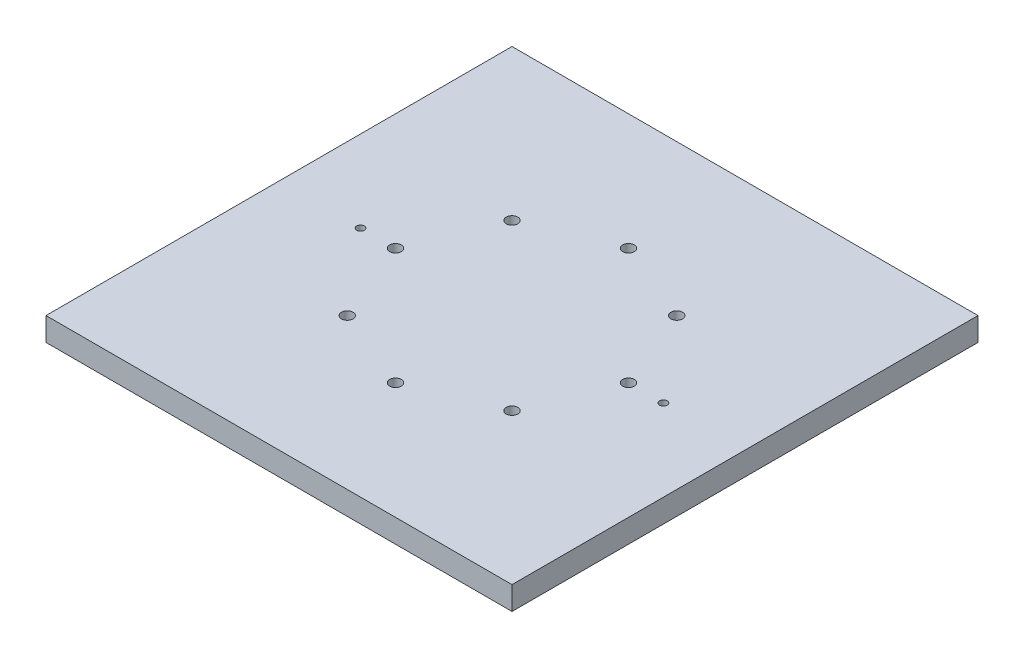
ISO-10303-21;
HEADER;
FILE_DESCRIPTION(('STEP AP214'),'2;1');
FILE_NAME('part.step','',(''),(''),'','','');
FILE_SCHEMA(('AUTOMOTIVE_DESIGN { 1 0 10303 214 1 1 1 1 }'));
ENDSEC;
DATA;
#1=APPLICATION_CONTEXT('core data for automotive mechanical design processes');
#2=APPLICATION_PROTOCOL_DEFINITION('international standard','automotive_design',2000,#1);
#3=PRODUCT_CONTEXT('',#1,'mechanical');
#4=PRODUCT('Part','Part','',(#3));
#5=PRODUCT_RELATED_PRODUCT_CATEGORY('part','',(#4));
#6=PRODUCT_DEFINITION_FORMATION('','',#4);
#7=PRODUCT_DEFINITION_CONTEXT('part definition',#1,'design');
#8=PRODUCT_DEFINITION('design','',#6,#7);
#9=PRODUCT_DEFINITION_SHAPE('','',#8);
#10=(LENGTH_UNIT() NAMED_UNIT(*) SI_UNIT(.MILLI.,.METRE.));
#11=(NAMED_UNIT(*) PLANE_ANGLE_UNIT() SI_UNIT($,.RADIAN.));
#12=(NAMED_UNIT(*) SI_UNIT($,.STERADIAN.) SOLID_ANGLE_UNIT());
#13=UNCERTAINTY_MEASURE_WITH_UNIT(LENGTH_MEASURE(1.E-05),#10,'distance_accuracy_value','');
#14=(GEOMETRIC_REPRESENTATION_CONTEXT(3) GLOBAL_UNCERTAINTY_ASSIGNED_CONTEXT((#13)) GLOBAL_UNIT_ASSIGNED_CONTEXT((#10,
#11,#12)) REPRESENTATION_CONTEXT('',''));
#15=CARTESIAN_POINT('',(0.,0.,0.));
#16=DIRECTION('',(0.,0.,1.));
#17=DIRECTION('',(1.,0.,0.));
#18=AXIS2_PLACEMENT_3D('',#15,#16,#17);
#19=CARTESIAN_POINT('',(127.,12.7,127.));
#20=DIRECTION('',(-1.,0.,0.));
#21=DIRECTION('',(0.,0.,1.));
#22=AXIS2_PLACEMENT_3D('',#19,#20,#21);
#23=PLANE('',#22);
#24=DIRECTION('',(0.,0.,-1.));
#25=VECTOR('',#24,1.);
#26=CARTESIAN_POINT('',(127.,0.,127.));
#27=LINE('',#26,#25);
#28=CARTESIAN_POINT('',(127.,0.,127.));
#29=VERTEX_POINT('',#28);
#30=CARTESIAN_POINT('',(127.,0.,-127.));
#31=VERTEX_POINT('',#30);
#32=EDGE_CURVE('E109',#29,#31,#27,.T.);
#33=ORIENTED_EDGE('',*,*,#32,.T.);
#34=DIRECTION('',(0.,-1.,0.));
#35=VECTOR('',#34,1.);
#36=CARTESIAN_POINT('',(127.,12.7,-127.));
#37=LINE('',#36,#35);
#38=CARTESIAN_POINT('',(127.,12.7,-127.));
#39=VERTEX_POINT('',#38);
#40=EDGE_CURVE('E13',#39,#31,#37,.T.);
#41=ORIENTED_EDGE('',*,*,#40,.F.);
#42=DIRECTION('',(0.,0.,-1.));
#43=VECTOR('',#42,1.);
#44=CARTESIAN_POINT('',(127.,12.7,127.));
#45=LINE('',#44,#43);
#46=CARTESIAN_POINT('',(127.,12.7,127.));
#47=VERTEX_POINT('',#46);
#48=EDGE_CURVE('E97',#47,#39,#45,.T.);
#49=ORIENTED_EDGE('',*,*,#48,.F.);
#50=DIRECTION('',(0.,-1.,0.));
#51=VECTOR('',#50,1.);
#52=CARTESIAN_POINT('',(127.,12.7,127.));
#53=LINE('',#52,#51);
#54=EDGE_CURVE('E105',#47,#29,#53,.T.);
#55=ORIENTED_EDGE('',*,*,#54,.T.);
#56=EDGE_LOOP('',(#33,#41,#49,#55));
#57=FACE_BOUND('',#56,.T.);
#58=ADVANCED_FACE('F46',(#57),#23,.F.);
#59=CARTESIAN_POINT('',(-127.,12.7,-127.));
#60=DIRECTION('',(0.,0.,1.));
#61=DIRECTION('',(1.,0.,0.));
#62=AXIS2_PLACEMENT_3D('',#59,#60,#61);
#63=PLANE('',#62);
#64=DIRECTION('',(-1.,0.,0.));
#65=VECTOR('',#64,1.);
#66=CARTESIAN_POINT('',(-127.,0.,-127.));
#67=LINE('',#66,#65);
#68=CARTESIAN_POINT('',(-127.,0.,-127.));
#69=VERTEX_POINT('',#68);
#70=EDGE_CURVE('E101',#31,#69,#67,.T.);
#71=ORIENTED_EDGE('',*,*,#70,.T.);
#72=DIRECTION('',(0.,-1.,0.));
#73=VECTOR('',#72,1.);
#74=CARTESIAN_POINT('',(-127.,12.7,-127.));
#75=LINE('',#74,#73);
#76=CARTESIAN_POINT('',(-127.,12.7,-127.));
#77=VERTEX_POINT('',#76);
#78=EDGE_CURVE('E54',#77,#69,#75,.T.);
#79=ORIENTED_EDGE('',*,*,#78,.F.);
#80=DIRECTION('',(-1.,0.,0.));
#81=VECTOR('',#80,1.);
#82=CARTESIAN_POINT('',(-127.,12.7,-127.));
#83=LINE('',#82,#81);
#84=EDGE_CURVE('E92',#39,#77,#83,.T.);
#85=ORIENTED_EDGE('',*,*,#84,.F.);
#86=ORIENTED_EDGE('',*,*,#40,.T.);
#87=EDGE_LOOP('',(#71,#79,#85,#86));
#88=FACE_BOUND('',#87,.T.);
#89=ADVANCED_FACE('F100',(#88),#63,.F.);
#90=CARTESIAN_POINT('',(-127.,12.7,127.));
#91=DIRECTION('',(1.,0.,0.));
#92=DIRECTION('',(0.,0.,-1.));
#93=AXIS2_PLACEMENT_3D('',#90,#91,#92);
#94=PLANE('',#93);
#95=DIRECTION('',(0.,0.,1.));
#96=VECTOR('',#95,1.);
#97=CARTESIAN_POINT('',(-127.,0.,127.));
#98=LINE('',#97,#96);
#99=CARTESIAN_POINT('',(-127.,0.,127.));
#100=VERTEX_POINT('',#99);
#101=EDGE_CURVE('E79',#69,#100,#98,.T.);
#102=ORIENTED_EDGE('',*,*,#101,.T.);
#103=DIRECTION('',(0.,-1.,0.));
#104=VECTOR('',#103,1.);
#105=CARTESIAN_POINT('',(-127.,12.7,127.));
#106=LINE('',#105,#104);
#107=CARTESIAN_POINT('',(-127.,12.7,127.));
#108=VERTEX_POINT('',#107);
#109=EDGE_CURVE('E102',#108,#100,#106,.T.);
#110=ORIENTED_EDGE('',*,*,#109,.F.);
#111=DIRECTION('',(0.,0.,1.));
#112=VECTOR('',#111,1.);
#113=CARTESIAN_POINT('',(-127.,12.7,127.));
#114=LINE('',#113,#112);
#115=EDGE_CURVE('E95',#77,#108,#114,.T.);
#116=ORIENTED_EDGE('',*,*,#115,.F.);
#117=ORIENTED_EDGE('',*,*,#78,.T.);
#118=EDGE_LOOP('',(#102,#110,#116,#117));
#119=FACE_BOUND('',#118,.T.);
#120=ADVANCED_FACE('F103',(#119),#94,.F.);
#121=CARTESIAN_POINT('',(-127.,12.7,127.));
#122=DIRECTION('',(0.,0.,-1.));
#123=DIRECTION('',(-1.,0.,0.));
#124=AXIS2_PLACEMENT_3D('',#121,#122,#123);
#125=PLANE('',#124);
#126=DIRECTION('',(1.,0.,0.));
#127=VECTOR('',#126,1.);
#128=CARTESIAN_POINT('',(-127.,0.,127.));
#129=LINE('',#128,#127);
#130=EDGE_CURVE('E85',#100,#29,#129,.T.);
#131=ORIENTED_EDGE('',*,*,#130,.T.);
#132=ORIENTED_EDGE('',*,*,#54,.F.);
#133=DIRECTION('',(1.,0.,0.));
#134=VECTOR('',#133,1.);
#135=CARTESIAN_POINT('',(-127.,12.7,127.));
#136=LINE('',#135,#134);
#137=EDGE_CURVE('E62',#108,#47,#136,.T.);
#138=ORIENTED_EDGE('',*,*,#137,.F.);
#139=ORIENTED_EDGE('',*,*,#109,.T.);
#140=EDGE_LOOP('',(#131,#132,#138,#139));
#141=FACE_BOUND('',#140,.T.);
#142=ADVANCED_FACE('F117',(#141),#125,.F.);
#143=CARTESIAN_POINT('',(0.,12.7,0.));
#144=DIRECTION('',(0.,-1.,0.));
#145=DIRECTION('',(0.,0.,-1.));
#146=AXIS2_PLACEMENT_3D('',#143,#144,#145);
#147=PLANE('',#146);
#148=CARTESIAN_POINT('',(-82.55,12.7,0.));
#149=DIRECTION('',(0.,-1.,0.));
#150=DIRECTION('',(0.,0.,-1.));
#151=AXIS2_PLACEMENT_3D('',#148,#149,#150);
#152=CIRCLE('',#151,2.0828);
#153=CARTESIAN_POINT('',(-82.55,12.7,-2.08279999999997));
#154=VERTEX_POINT('',#153);
#155=EDGE_CURVE('E151',#154,#154,#152,.T.);
#156=ORIENTED_EDGE('',*,*,#155,.T.);
#157=EDGE_LOOP('',(#156));
#158=FACE_BOUND('',#157,.T.);
#159=CARTESIAN_POINT('',(82.55,12.7,0.));
#160=DIRECTION('',(0.,-1.,0.));
#161=DIRECTION('',(0.,0.,-1.));
#162=AXIS2_PLACEMENT_3D('',#159,#160,#161);
#163=CIRCLE('',#162,2.0828);
#164=CARTESIAN_POINT('',(82.55,12.7,-2.08279999999999));
#165=VERTEX_POINT('',#164);
#166=EDGE_CURVE('E173',#165,#165,#163,.T.);
#167=ORIENTED_EDGE('',*,*,#166,.T.);
#168=EDGE_LOOP('',(#167));
#169=FACE_BOUND('',#168,.T.);
#170=CARTESIAN_POINT('',(0.,12.7,-63.5));
#171=DIRECTION('',(0.,-1.,0.));
#172=DIRECTION('',(0.,0.,-1.));
#173=AXIS2_PLACEMENT_3D('',#170,#171,#172);
#174=CIRCLE('',#173,3.175);
#175=CARTESIAN_POINT('',(0.,12.7,-66.675));
#176=VERTEX_POINT('',#175);
#177=EDGE_CURVE('E112',#176,#176,#174,.T.);
#178=ORIENTED_EDGE('',*,*,#177,.T.);
#179=EDGE_LOOP('',(#178));
#180=FACE_BOUND('',#179,.T.);
#181=CARTESIAN_POINT('',(44.9012806053459,12.7,-44.9012806053457));
#182=DIRECTION('',(0.,-1.,0.));
#183=DIRECTION('',(0.,0.,-1.));
#184=AXIS2_PLACEMENT_3D('',#181,#182,#183);
#185=CIRCLE('',#184,3.17499999999998);
#186=CARTESIAN_POINT('',(44.9012806053459,12.7,-48.0762806053456));
#187=VERTEX_POINT('',#186);
#188=EDGE_CURVE('E125',#187,#187,#185,.T.);
#189=ORIENTED_EDGE('',*,*,#188,.T.);
#190=EDGE_LOOP('',(#189));
#191=FACE_BOUND('',#190,.T.);
#192=CARTESIAN_POINT('',(63.5,12.7,2.38641928986795E-13));
#193=DIRECTION('',(0.,-1.,0.));
#194=DIRECTION('',(0.,0.,-1.));
#195=AXIS2_PLACEMENT_3D('',#192,#193,#194);
#196=CIRCLE('',#195,3.175);
#197=CARTESIAN_POINT('',(63.5,12.7,-3.17499999999976));
#198=VERTEX_POINT('',#197);
#199=EDGE_CURVE('E128',#198,#198,#196,.T.);
#200=ORIENTED_EDGE('',*,*,#199,.T.);
#201=EDGE_LOOP('',(#200));
#202=FACE_BOUND('',#201,.T.);
#203=CARTESIAN_POINT('',(44.9012806053455,12.7,44.901280605346));
#204=DIRECTION('',(0.,-1.,0.));
#205=DIRECTION('',(0.,0.,-1.));
#206=AXIS2_PLACEMENT_3D('',#203,#204,#205);
#207=CIRCLE('',#206,3.17499999999999);
#208=CARTESIAN_POINT('',(44.9012806053455,12.7,41.726280605346));
#209=VERTEX_POINT('',#208);
#210=EDGE_CURVE('E131',#209,#209,#207,.T.);
#211=ORIENTED_EDGE('',*,*,#210,.T.);
#212=EDGE_LOOP('',(#211));
#213=FACE_BOUND('',#212,.T.);
#214=CARTESIAN_POINT('',(-4.60350994003334E-13,12.7,63.5));
#215=DIRECTION('',(0.,-1.,0.));
#216=DIRECTION('',(0.,0.,-1.));
#217=AXIS2_PLACEMENT_3D('',#214,#215,#216);
#218=CIRCLE('',#217,3.17499999999999);
#219=CARTESIAN_POINT('',(-4.60350994003334E-13,12.7,60.325));
#220=VERTEX_POINT('',#219);
#221=EDGE_CURVE('E134',#220,#220,#218,.T.);
#222=ORIENTED_EDGE('',*,*,#221,.T.);
#223=EDGE_LOOP('',(#222));
#224=FACE_BOUND('',#223,.T.);
#225=CARTESIAN_POINT('',(-44.9012806053462,12.7,44.9012806053454));
#226=DIRECTION('',(0.,-1.,0.));
#227=DIRECTION('',(0.,0.,-1.));
#228=AXIS2_PLACEMENT_3D('',#225,#226,#227);
#229=CIRCLE('',#228,3.175);
#230=CARTESIAN_POINT('',(-44.9012806053462,12.7,41.7262806053454));
#231=VERTEX_POINT('',#230);
#232=EDGE_CURVE('E137',#231,#231,#229,.T.);
#233=ORIENTED_EDGE('',*,*,#232,.T.);
#234=EDGE_LOOP('',(#233));
#235=FACE_BOUND('',#234,.T.);
#236=CARTESIAN_POINT('',(-63.5,12.7,-6.82060059019873E-13));
#237=DIRECTION('',(0.,-1.,0.));
#238=DIRECTION('',(0.,0.,-1.));
#239=AXIS2_PLACEMENT_3D('',#236,#237,#238);
#240=CIRCLE('',#239,3.175);
#241=CARTESIAN_POINT('',(-63.5,12.7,-3.17500000000068));
#242=VERTEX_POINT('',#241);
#243=EDGE_CURVE('E140',#242,#242,#240,.T.);
#244=ORIENTED_EDGE('',*,*,#243,.T.);
#245=EDGE_LOOP('',(#244));
#246=FACE_BOUND('',#245,.T.);
#247=CARTESIAN_POINT('',(-44.9012806053452,12.7,-44.9012806053463));
#248=DIRECTION('',(0.,-1.,0.));
#249=DIRECTION('',(0.,0.,-1.));
#250=AXIS2_PLACEMENT_3D('',#247,#248,#249);
#251=CIRCLE('',#250,3.17499999999999);
#252=CARTESIAN_POINT('',(-44.9012806053452,12.7,-48.0762806053463));
#253=VERTEX_POINT('',#252);
#254=EDGE_CURVE('E143',#253,#253,#251,.T.);
#255=ORIENTED_EDGE('',*,*,#254,.T.);
#256=EDGE_LOOP('',(#255));
#257=FACE_BOUND('',#256,.T.);
#258=ORIENTED_EDGE('',*,*,#48,.T.);
#259=ORIENTED_EDGE('',*,*,#84,.T.);
#260=ORIENTED_EDGE('',*,*,#115,.T.);
#261=ORIENTED_EDGE('',*,*,#137,.T.);
#262=EDGE_LOOP('',(#258,#259,#260,#261));
#263=FACE_BOUND('',#262,.T.);
#264=ADVANCED_FACE('F93',(#158,#169,#180,#191,#202,#213,#224,#235,#246,#257,#263),#147,.F.);
#265=CARTESIAN_POINT('',(0.,0.,0.));
#266=DIRECTION('',(0.,-1.,0.));
#267=DIRECTION('',(0.,0.,-1.));
#268=AXIS2_PLACEMENT_3D('',#265,#266,#267);
#269=PLANE('',#268);
#270=CARTESIAN_POINT('',(-82.55,0.,0.));
#271=DIRECTION('',(0.,1.,0.));
#272=DIRECTION('',(0.,0.,1.));
#273=AXIS2_PLACEMENT_3D('',#270,#271,#272);
#274=CIRCLE('',#273,2.0828);
#275=CARTESIAN_POINT('',(-82.55,0.,2.08280000000003));
#276=VERTEX_POINT('',#275);
#277=EDGE_CURVE('E176',#276,#276,#274,.T.);
#278=ORIENTED_EDGE('',*,*,#277,.T.);
#279=EDGE_LOOP('',(#278));
#280=FACE_BOUND('',#279,.T.);
#281=CARTESIAN_POINT('',(82.55,0.,0.));
#282=DIRECTION('',(0.,1.,0.));
#283=DIRECTION('',(0.,0.,1.));
#284=AXIS2_PLACEMENT_3D('',#281,#282,#283);
#285=CIRCLE('',#284,2.0828);
#286=CARTESIAN_POINT('',(82.55,0.,2.08280000000001));
#287=VERTEX_POINT('',#286);
#288=EDGE_CURVE('E177',#287,#287,#285,.T.);
#289=ORIENTED_EDGE('',*,*,#288,.T.);
#290=EDGE_LOOP('',(#289));
#291=FACE_BOUND('',#290,.T.);
#292=CARTESIAN_POINT('',(0.,0.,-63.5));
#293=DIRECTION('',(0.,1.,0.));
#294=DIRECTION('',(0.,0.,1.));
#295=AXIS2_PLACEMENT_3D('',#292,#293,#294);
#296=CIRCLE('',#295,3.175);
#297=CARTESIAN_POINT('',(0.,0.,-60.325));
#298=VERTEX_POINT('',#297);
#299=EDGE_CURVE('E146',#298,#298,#296,.T.);
#300=ORIENTED_EDGE('',*,*,#299,.T.);
#301=EDGE_LOOP('',(#300));
#302=FACE_BOUND('',#301,.T.);
#303=CARTESIAN_POINT('',(44.9012806053459,0.,-44.9012806053457));
#304=DIRECTION('',(0.,1.,0.));
#305=DIRECTION('',(0.,0.,1.));
#306=AXIS2_PLACEMENT_3D('',#303,#304,#305);
#307=CIRCLE('',#306,3.17499999999998);
#308=CARTESIAN_POINT('',(44.9012806053459,0.,-41.7262806053457));
#309=VERTEX_POINT('',#308);
#310=EDGE_CURVE('E166',#309,#309,#307,.T.);
#311=ORIENTED_EDGE('',*,*,#310,.T.);
#312=EDGE_LOOP('',(#311));
#313=FACE_BOUND('',#312,.T.);
#314=CARTESIAN_POINT('',(63.5,0.,2.38641928986795E-13));
#315=DIRECTION('',(0.,1.,0.));
#316=DIRECTION('',(0.,0.,1.));
#317=AXIS2_PLACEMENT_3D('',#314,#315,#316);
#318=CIRCLE('',#317,3.175);
#319=CARTESIAN_POINT('',(63.5,0.,3.17500000000023));
#320=VERTEX_POINT('',#319);
#321=EDGE_CURVE('E163',#320,#320,#318,.T.);
#322=ORIENTED_EDGE('',*,*,#321,.T.);
#323=EDGE_LOOP('',(#322));
#324=FACE_BOUND('',#323,.T.);
#325=CARTESIAN_POINT('',(44.9012806053455,0.,44.901280605346));
#326=DIRECTION('',(0.,1.,0.));
#327=DIRECTION('',(0.,0.,1.));
#328=AXIS2_PLACEMENT_3D('',#325,#326,#327);
#329=CIRCLE('',#328,3.17499999999999);
#330=CARTESIAN_POINT('',(44.9012806053455,0.,48.076280605346));
#331=VERTEX_POINT('',#330);
#332=EDGE_CURVE('E160',#331,#331,#329,.T.);
#333=ORIENTED_EDGE('',*,*,#332,.T.);
#334=EDGE_LOOP('',(#333));
#335=FACE_BOUND('',#334,.T.);
#336=CARTESIAN_POINT('',(-4.60350994003334E-13,0.,63.5));
#337=DIRECTION('',(0.,1.,0.));
#338=DIRECTION('',(0.,0.,1.));
#339=AXIS2_PLACEMENT_3D('',#336,#337,#338);
#340=CIRCLE('',#339,3.17499999999999);
#341=CARTESIAN_POINT('',(-4.60350994003334E-13,0.,66.675));
#342=VERTEX_POINT('',#341);
#343=EDGE_CURVE('E157',#342,#342,#340,.T.);
#344=ORIENTED_EDGE('',*,*,#343,.T.);
#345=EDGE_LOOP('',(#344));
#346=FACE_BOUND('',#345,.T.);
#347=CARTESIAN_POINT('',(-44.9012806053462,0.,44.9012806053454));
#348=DIRECTION('',(0.,1.,0.));
#349=DIRECTION('',(0.,0.,1.));
#350=AXIS2_PLACEMENT_3D('',#347,#348,#349);
#351=CIRCLE('',#350,3.175);
#352=CARTESIAN_POINT('',(-44.9012806053462,0.,48.0762806053454));
#353=VERTEX_POINT('',#352);
#354=EDGE_CURVE('E154',#353,#353,#351,.T.);
#355=ORIENTED_EDGE('',*,*,#354,.T.);
#356=EDGE_LOOP('',(#355));
#357=FACE_BOUND('',#356,.T.);
#358=CARTESIAN_POINT('',(-63.5,0.,-6.82060059019873E-13));
#359=DIRECTION('',(0.,1.,0.));
#360=DIRECTION('',(0.,0.,1.));
#361=AXIS2_PLACEMENT_3D('',#358,#359,#360);
#362=CIRCLE('',#361,3.175);
#363=CARTESIAN_POINT('',(-63.5,0.,3.17499999999932));
#364=VERTEX_POINT('',#363);
#365=EDGE_CURVE('E150',#364,#364,#362,.T.);
#366=ORIENTED_EDGE('',*,*,#365,.T.);
#367=EDGE_LOOP('',(#366));
#368=FACE_BOUND('',#367,.T.);
#369=CARTESIAN_POINT('',(-44.9012806053452,0.,-44.9012806053463));
#370=DIRECTION('',(0.,1.,0.));
#371=DIRECTION('',(0.,0.,1.));
#372=AXIS2_PLACEMENT_3D('',#369,#370,#371);
#373=CIRCLE('',#372,3.17499999999999);
#374=CARTESIAN_POINT('',(-44.9012806053452,0.,-41.7262806053464));
#375=VERTEX_POINT('',#374);
#376=EDGE_CURVE('E147',#375,#375,#373,.T.);
#377=ORIENTED_EDGE('',*,*,#376,.T.);
#378=EDGE_LOOP('',(#377));
#379=FACE_BOUND('',#378,.T.);
#380=ORIENTED_EDGE('',*,*,#32,.F.);
#381=ORIENTED_EDGE('',*,*,#130,.F.);
#382=ORIENTED_EDGE('',*,*,#101,.F.);
#383=ORIENTED_EDGE('',*,*,#70,.F.);
#384=EDGE_LOOP('',(#380,#381,#382,#383));
#385=FACE_BOUND('',#384,.T.);
#386=ADVANCED_FACE('F120',(#280,#291,#302,#313,#324,#335,#346,#357,#368,#379,#385),#269,.T.);
#387=CARTESIAN_POINT('',(-44.9012806053452,0.,-44.9012806053463));
#388=DIRECTION('',(0.,1.,0.));
#389=DIRECTION('',(0.,0.,1.));
#390=AXIS2_PLACEMENT_3D('',#387,#388,#389);
#391=CYLINDRICAL_SURFACE('',#390,3.17499999999999);
#392=ORIENTED_EDGE('',*,*,#376,.F.);
#393=EDGE_LOOP('',(#392));
#394=FACE_BOUND('',#393,.T.);
#395=ORIENTED_EDGE('',*,*,#254,.F.);
#396=EDGE_LOOP('',(#395));
#397=FACE_BOUND('',#396,.T.);
#398=ADVANCED_FACE('F213',(#394,#397),#391,.F.);
#399=CARTESIAN_POINT('',(-63.5,0.,-6.82060059019873E-13));
#400=DIRECTION('',(0.,1.,0.));
#401=DIRECTION('',(0.,0.,1.));
#402=AXIS2_PLACEMENT_3D('',#399,#400,#401);
#403=CYLINDRICAL_SURFACE('',#402,3.175);
#404=ORIENTED_EDGE('',*,*,#365,.F.);
#405=EDGE_LOOP('',(#404));
#406=FACE_BOUND('',#405,.T.);
#407=ORIENTED_EDGE('',*,*,#243,.F.);
#408=EDGE_LOOP('',(#407));
#409=FACE_BOUND('',#408,.T.);
#410=ADVANCED_FACE('F215',(#406,#409),#403,.F.);
#411=CARTESIAN_POINT('',(-44.9012806053462,0.,44.9012806053454));
#412=DIRECTION('',(0.,1.,0.));
#413=DIRECTION('',(0.,0.,1.));
#414=AXIS2_PLACEMENT_3D('',#411,#412,#413);
#415=CYLINDRICAL_SURFACE('',#414,3.175);
#416=ORIENTED_EDGE('',*,*,#354,.F.);
#417=EDGE_LOOP('',(#416));
#418=FACE_BOUND('',#417,.T.);
#419=ORIENTED_EDGE('',*,*,#232,.F.);
#420=EDGE_LOOP('',(#419));
#421=FACE_BOUND('',#420,.T.);
#422=ADVANCED_FACE('F222',(#418,#421),#415,.F.);
#423=CARTESIAN_POINT('',(-4.60350994003334E-13,0.,63.5));
#424=DIRECTION('',(0.,1.,0.));
#425=DIRECTION('',(0.,0.,1.));
#426=AXIS2_PLACEMENT_3D('',#423,#424,#425);
#427=CYLINDRICAL_SURFACE('',#426,3.17499999999999);
#428=ORIENTED_EDGE('',*,*,#343,.F.);
#429=EDGE_LOOP('',(#428));
#430=FACE_BOUND('',#429,.T.);
#431=ORIENTED_EDGE('',*,*,#221,.F.);
#432=EDGE_LOOP('',(#431));
#433=FACE_BOUND('',#432,.T.);
#434=ADVANCED_FACE('F298',(#430,#433),#427,.F.);
#435=CARTESIAN_POINT('',(44.9012806053455,0.,44.901280605346));
#436=DIRECTION('',(0.,1.,0.));
#437=DIRECTION('',(0.,0.,1.));
#438=AXIS2_PLACEMENT_3D('',#435,#436,#437);
#439=CYLINDRICAL_SURFACE('',#438,3.17499999999999);
#440=ORIENTED_EDGE('',*,*,#332,.F.);
#441=EDGE_LOOP('',(#440));
#442=FACE_BOUND('',#441,.T.);
#443=ORIENTED_EDGE('',*,*,#210,.F.);
#444=EDGE_LOOP('',(#443));
#445=FACE_BOUND('',#444,.T.);
#446=ADVANCED_FACE('F290',(#442,#445),#439,.F.);
#447=CARTESIAN_POINT('',(63.5,0.,2.38641928986795E-13));
#448=DIRECTION('',(0.,1.,0.));
#449=DIRECTION('',(0.,0.,1.));
#450=AXIS2_PLACEMENT_3D('',#447,#448,#449);
#451=CYLINDRICAL_SURFACE('',#450,3.175);
#452=ORIENTED_EDGE('',*,*,#321,.F.);
#453=EDGE_LOOP('',(#452));
#454=FACE_BOUND('',#453,.T.);
#455=ORIENTED_EDGE('',*,*,#199,.F.);
#456=EDGE_LOOP('',(#455));
#457=FACE_BOUND('',#456,.T.);
#458=ADVANCED_FACE('F282',(#454,#457),#451,.F.);
#459=CARTESIAN_POINT('',(44.9012806053459,0.,-44.9012806053457));
#460=DIRECTION('',(0.,1.,0.));
#461=DIRECTION('',(0.,0.,1.));
#462=AXIS2_PLACEMENT_3D('',#459,#460,#461);
#463=CYLINDRICAL_SURFACE('',#462,3.17499999999998);
#464=ORIENTED_EDGE('',*,*,#310,.F.);
#465=EDGE_LOOP('',(#464));
#466=FACE_BOUND('',#465,.T.);
#467=ORIENTED_EDGE('',*,*,#188,.F.);
#468=EDGE_LOOP('',(#467));
#469=FACE_BOUND('',#468,.T.);
#470=ADVANCED_FACE('F275',(#466,#469),#463,.F.);
#471=CARTESIAN_POINT('',(0.,0.,-63.5));
#472=DIRECTION('',(0.,1.,0.));
#473=DIRECTION('',(0.,0.,1.));
#474=AXIS2_PLACEMENT_3D('',#471,#472,#473);
#475=CYLINDRICAL_SURFACE('',#474,3.175);
#476=ORIENTED_EDGE('',*,*,#299,.F.);
#477=EDGE_LOOP('',(#476));
#478=FACE_BOUND('',#477,.T.);
#479=ORIENTED_EDGE('',*,*,#177,.F.);
#480=EDGE_LOOP('',(#479));
#481=FACE_BOUND('',#480,.T.);
#482=ADVANCED_FACE('F260',(#478,#481),#475,.F.);
#483=CARTESIAN_POINT('',(82.55,0.,0.));
#484=DIRECTION('',(0.,1.,0.));
#485=DIRECTION('',(0.,0.,1.));
#486=AXIS2_PLACEMENT_3D('',#483,#484,#485);
#487=CYLINDRICAL_SURFACE('',#486,2.0828);
#488=ORIENTED_EDGE('',*,*,#288,.F.);
#489=EDGE_LOOP('',(#488));
#490=FACE_BOUND('',#489,.T.);
#491=ORIENTED_EDGE('',*,*,#166,.F.);
#492=EDGE_LOOP('',(#491));
#493=FACE_BOUND('',#492,.T.);
#494=ADVANCED_FACE('F188',(#490,#493),#487,.F.);
#495=CARTESIAN_POINT('',(-82.55,0.,0.));
#496=DIRECTION('',(0.,1.,0.));
#497=DIRECTION('',(0.,0.,1.));
#498=AXIS2_PLACEMENT_3D('',#495,#496,#497);
#499=CYLINDRICAL_SURFACE('',#498,2.0828);
#500=ORIENTED_EDGE('',*,*,#277,.F.);
#501=EDGE_LOOP('',(#500));
#502=FACE_BOUND('',#501,.T.);
#503=ORIENTED_EDGE('',*,*,#155,.F.);
#504=EDGE_LOOP('',(#503));
#505=FACE_BOUND('',#504,.T.);
#506=ADVANCED_FACE('F185',(#502,#505),#499,.F.);
#507=CLOSED_SHELL('',(#58,#89,#120,#142,#264,#386,#398,#410,#422,#434,#446,#458,#470,#482,#494,#506));
#508=MANIFOLD_SOLID_BREP('B2',#507);
#509=ADVANCED_BREP_SHAPE_REPRESENTATION('',(#18,#508),#14);
#510=SHAPE_DEFINITION_REPRESENTATION(#9,#509);
ENDSEC;
END-ISO-10303-21;
